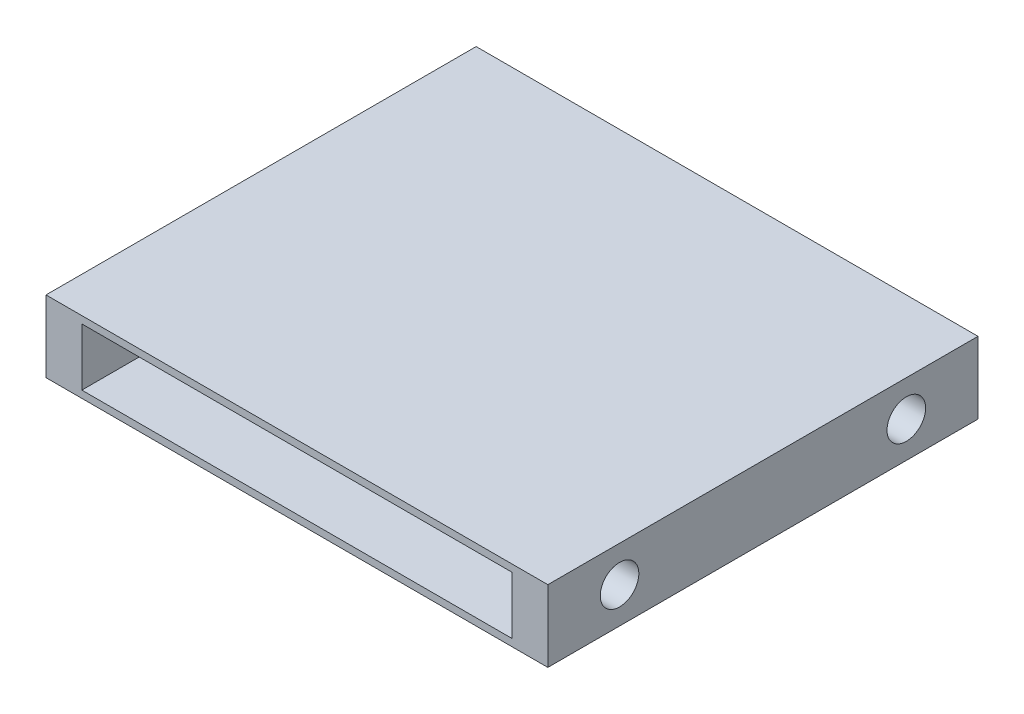
ISO-10303-21;
HEADER;
FILE_DESCRIPTION(('STEP AP214'),'2;1');
FILE_NAME('part.step','',(''),(''),'','','');
FILE_SCHEMA(('AUTOMOTIVE_DESIGN { 1 0 10303 214 1 1 1 1 }'));
ENDSEC;
DATA;
#1=APPLICATION_CONTEXT('core data for automotive mechanical design processes');
#2=APPLICATION_PROTOCOL_DEFINITION('international standard','automotive_design',2000,#1);
#3=PRODUCT_CONTEXT('',#1,'mechanical');
#4=PRODUCT('Part','Part','',(#3));
#5=PRODUCT_RELATED_PRODUCT_CATEGORY('part','',(#4));
#6=PRODUCT_DEFINITION_FORMATION('','',#4);
#7=PRODUCT_DEFINITION_CONTEXT('part definition',#1,'design');
#8=PRODUCT_DEFINITION('design','',#6,#7);
#9=PRODUCT_DEFINITION_SHAPE('','',#8);
#10=(LENGTH_UNIT() NAMED_UNIT(*) SI_UNIT(.MILLI.,.METRE.));
#11=(NAMED_UNIT(*) PLANE_ANGLE_UNIT() SI_UNIT($,.RADIAN.));
#12=(NAMED_UNIT(*) SI_UNIT($,.STERADIAN.) SOLID_ANGLE_UNIT());
#13=UNCERTAINTY_MEASURE_WITH_UNIT(LENGTH_MEASURE(1.E-05),#10,'distance_accuracy_value','');
#14=(GEOMETRIC_REPRESENTATION_CONTEXT(3) GLOBAL_UNCERTAINTY_ASSIGNED_CONTEXT((#13)) GLOBAL_UNIT_ASSIGNED_CONTEXT((#10,
#11,#12)) REPRESENTATION_CONTEXT('',''));
#15=CARTESIAN_POINT('',(0.,0.,0.));
#16=DIRECTION('',(0.,0.,1.));
#17=DIRECTION('',(1.,0.,0.));
#18=AXIS2_PLACEMENT_3D('',#15,#16,#17);
#19=CARTESIAN_POINT('',(0.,10.,0.));
#20=DIRECTION('',(1.,0.,0.));
#21=DIRECTION('',(0.,0.,-1.));
#22=AXIS2_PLACEMENT_3D('',#19,#20,#21);
#23=PLANE('',#22);
#24=CARTESIAN_POINT('',(0.,5.,50.));
#25=DIRECTION('',(1.,0.,0.));
#26=DIRECTION('',(0.,0.,-1.));
#27=AXIS2_PLACEMENT_3D('',#24,#25,#26);
#28=CIRCLE('',#27,2.68983581979043);
#29=CARTESIAN_POINT('',(0.,5.,47.3101641802095));
#30=VERTEX_POINT('',#29);
#31=EDGE_CURVE('E200',#30,#30,#28,.T.);
#32=ORIENTED_EDGE('',*,*,#31,.T.);
#33=EDGE_LOOP('',(#32));
#34=FACE_BOUND('',#33,.T.);
#35=CARTESIAN_POINT('',(0.,5.,10.));
#36=DIRECTION('',(1.,0.,0.));
#37=DIRECTION('',(0.,0.,-1.));
#38=AXIS2_PLACEMENT_3D('',#35,#36,#37);
#39=CIRCLE('',#38,2.68983581979043);
#40=CARTESIAN_POINT('',(0.,5.,7.31016418020958));
#41=VERTEX_POINT('',#40);
#42=EDGE_CURVE('E203',#41,#41,#39,.F.);
#43=ORIENTED_EDGE('',*,*,#42,.F.);
#44=EDGE_LOOP('',(#43));
#45=FACE_BOUND('',#44,.T.);
#46=DIRECTION('',(0.,0.,1.));
#47=VECTOR('',#46,1.);
#48=CARTESIAN_POINT('',(0.,0.,0.));
#49=LINE('',#48,#47);
#50=CARTESIAN_POINT('',(0.,0.,0.));
#51=VERTEX_POINT('',#50);
#52=CARTESIAN_POINT('',(0.,0.,60.));
#53=VERTEX_POINT('',#52);
#54=EDGE_CURVE('E146',#51,#53,#49,.T.);
#55=ORIENTED_EDGE('',*,*,#54,.T.);
#56=DIRECTION('',(0.,-1.,0.));
#57=VECTOR('',#56,1.);
#58=CARTESIAN_POINT('',(0.,10.,60.));
#59=LINE('',#58,#57);
#60=CARTESIAN_POINT('',(0.,10.,60.));
#61=VERTEX_POINT('',#60);
#62=EDGE_CURVE('E11',#61,#53,#59,.T.);
#63=ORIENTED_EDGE('',*,*,#62,.F.);
#64=DIRECTION('',(0.,0.,1.));
#65=VECTOR('',#64,1.);
#66=CARTESIAN_POINT('',(0.,10.,0.));
#67=LINE('',#66,#65);
#68=CARTESIAN_POINT('',(0.,10.,0.));
#69=VERTEX_POINT('',#68);
#70=EDGE_CURVE('E150',#69,#61,#67,.T.);
#71=ORIENTED_EDGE('',*,*,#70,.F.);
#72=DIRECTION('',(0.,-1.,0.));
#73=VECTOR('',#72,1.);
#74=CARTESIAN_POINT('',(0.,10.,0.));
#75=LINE('',#74,#73);
#76=EDGE_CURVE('E156',#69,#51,#75,.T.);
#77=ORIENTED_EDGE('',*,*,#76,.T.);
#78=EDGE_LOOP('',(#55,#63,#71,#77));
#79=FACE_BOUND('',#78,.T.);
#80=ADVANCED_FACE('F35',(#34,#45,#79),#23,.F.);
#81=CARTESIAN_POINT('',(0.,10.,60.));
#82=DIRECTION('',(0.,0.,-1.));
#83=DIRECTION('',(-1.,0.,0.));
#84=AXIS2_PLACEMENT_3D('',#81,#82,#83);
#85=PLANE('',#84);
#86=DIRECTION('',(1.,0.,0.));
#87=VECTOR('',#86,1.);
#88=CARTESIAN_POINT('',(5.00000000000002,0.999999999999999,60.));
#89=LINE('',#88,#87);
#90=CARTESIAN_POINT('',(5.00000000000002,0.999999999999999,60.));
#91=VERTEX_POINT('',#90);
#92=CARTESIAN_POINT('',(65.,0.999999999999999,60.));
#93=VERTEX_POINT('',#92);
#94=EDGE_CURVE('E140',#91,#93,#89,.T.);
#95=ORIENTED_EDGE('',*,*,#94,.F.);
#96=DIRECTION('',(0.,-1.,0.));
#97=VECTOR('',#96,1.);
#98=CARTESIAN_POINT('',(5.00000000000001,9.,60.));
#99=LINE('',#98,#97);
#100=CARTESIAN_POINT('',(5.00000000000001,9.,60.));
#101=VERTEX_POINT('',#100);
#102=EDGE_CURVE('E49',#101,#91,#99,.T.);
#103=ORIENTED_EDGE('',*,*,#102,.F.);
#104=DIRECTION('',(-1.,0.,0.));
#105=VECTOR('',#104,1.);
#106=CARTESIAN_POINT('',(5.00000000000001,9.,60.));
#107=LINE('',#106,#105);
#108=CARTESIAN_POINT('',(65.,9.,60.));
#109=VERTEX_POINT('',#108);
#110=EDGE_CURVE('E128',#109,#101,#107,.T.);
#111=ORIENTED_EDGE('',*,*,#110,.F.);
#112=DIRECTION('',(0.,1.,0.));
#113=VECTOR('',#112,1.);
#114=CARTESIAN_POINT('',(65.,9.,60.));
#115=LINE('',#114,#113);
#116=EDGE_CURVE('E131',#93,#109,#115,.T.);
#117=ORIENTED_EDGE('',*,*,#116,.F.);
#118=EDGE_LOOP('',(#95,#103,#111,#117));
#119=FACE_BOUND('',#118,.T.);
#120=DIRECTION('',(1.,0.,0.));
#121=VECTOR('',#120,1.);
#122=CARTESIAN_POINT('',(0.,0.,60.));
#123=LINE('',#122,#121);
#124=CARTESIAN_POINT('',(70.,0.,60.));
#125=VERTEX_POINT('',#124);
#126=EDGE_CURVE('E159',#53,#125,#123,.T.);
#127=ORIENTED_EDGE('',*,*,#126,.T.);
#128=DIRECTION('',(0.,-1.,0.));
#129=VECTOR('',#128,1.);
#130=CARTESIAN_POINT('',(70.,10.,60.));
#131=LINE('',#130,#129);
#132=CARTESIAN_POINT('',(70.,10.,60.));
#133=VERTEX_POINT('',#132);
#134=EDGE_CURVE('E42',#133,#125,#131,.T.);
#135=ORIENTED_EDGE('',*,*,#134,.F.);
#136=DIRECTION('',(1.,0.,0.));
#137=VECTOR('',#136,1.);
#138=CARTESIAN_POINT('',(0.,10.,60.));
#139=LINE('',#138,#137);
#140=EDGE_CURVE('E86',#61,#133,#139,.T.);
#141=ORIENTED_EDGE('',*,*,#140,.F.);
#142=ORIENTED_EDGE('',*,*,#62,.T.);
#143=EDGE_LOOP('',(#127,#135,#141,#142));
#144=FACE_BOUND('',#143,.T.);
#145=ADVANCED_FACE('F187',(#119,#144),#85,.F.);
#146=CARTESIAN_POINT('',(70.,10.,0.));
#147=DIRECTION('',(-1.,0.,0.));
#148=DIRECTION('',(0.,0.,1.));
#149=AXIS2_PLACEMENT_3D('',#146,#147,#148);
#150=PLANE('',#149);
#151=CARTESIAN_POINT('',(70.,5.,50.));
#152=DIRECTION('',(-1.,0.,0.));
#153=DIRECTION('',(0.,0.,1.));
#154=AXIS2_PLACEMENT_3D('',#151,#152,#153);
#155=CIRCLE('',#154,2.68983581979043);
#156=CARTESIAN_POINT('',(70.,5.,52.6898358197904));
#157=VERTEX_POINT('',#156);
#158=EDGE_CURVE('E216',#157,#157,#155,.F.);
#159=ORIENTED_EDGE('',*,*,#158,.F.);
#160=EDGE_LOOP('',(#159));
#161=FACE_BOUND('',#160,.T.);
#162=CARTESIAN_POINT('',(70.,5.,10.));
#163=DIRECTION('',(-1.,0.,0.));
#164=DIRECTION('',(0.,0.,1.));
#165=AXIS2_PLACEMENT_3D('',#162,#163,#164);
#166=CIRCLE('',#165,2.68983581979043);
#167=CARTESIAN_POINT('',(70.,5.,12.6898358197904));
#168=VERTEX_POINT('',#167);
#169=EDGE_CURVE('E134',#168,#168,#166,.T.);
#170=ORIENTED_EDGE('',*,*,#169,.T.);
#171=EDGE_LOOP('',(#170));
#172=FACE_BOUND('',#171,.T.);
#173=DIRECTION('',(0.,0.,-1.));
#174=VECTOR('',#173,1.);
#175=CARTESIAN_POINT('',(70.,0.,0.));
#176=LINE('',#175,#174);
#177=CARTESIAN_POINT('',(70.,0.,0.));
#178=VERTEX_POINT('',#177);
#179=EDGE_CURVE('E161',#125,#178,#176,.T.);
#180=ORIENTED_EDGE('',*,*,#179,.T.);
#181=DIRECTION('',(0.,-1.,0.));
#182=VECTOR('',#181,1.);
#183=CARTESIAN_POINT('',(70.,10.,0.));
#184=LINE('',#183,#182);
#185=CARTESIAN_POINT('',(70.,10.,0.));
#186=VERTEX_POINT('',#185);
#187=EDGE_CURVE('E165',#186,#178,#184,.T.);
#188=ORIENTED_EDGE('',*,*,#187,.F.);
#189=DIRECTION('',(0.,0.,-1.));
#190=VECTOR('',#189,1.);
#191=CARTESIAN_POINT('',(70.,10.,0.));
#192=LINE('',#191,#190);
#193=EDGE_CURVE('E153',#133,#186,#192,.T.);
#194=ORIENTED_EDGE('',*,*,#193,.F.);
#195=ORIENTED_EDGE('',*,*,#134,.T.);
#196=EDGE_LOOP('',(#180,#188,#194,#195));
#197=FACE_BOUND('',#196,.T.);
#198=ADVANCED_FACE('F170',(#161,#172,#197),#150,.F.);
#199=CARTESIAN_POINT('',(0.,10.,0.));
#200=DIRECTION('',(0.,0.,1.));
#201=DIRECTION('',(1.,0.,0.));
#202=AXIS2_PLACEMENT_3D('',#199,#200,#201);
#203=PLANE('',#202);
#204=DIRECTION('',(-1.,0.,0.));
#205=VECTOR('',#204,1.);
#206=CARTESIAN_POINT('',(0.,0.,0.));
#207=LINE('',#206,#205);
#208=EDGE_CURVE('E79',#178,#51,#207,.T.);
#209=ORIENTED_EDGE('',*,*,#208,.T.);
#210=ORIENTED_EDGE('',*,*,#76,.F.);
#211=DIRECTION('',(-1.,0.,0.));
#212=VECTOR('',#211,1.);
#213=CARTESIAN_POINT('',(0.,10.,0.));
#214=LINE('',#213,#212);
#215=EDGE_CURVE('E58',#186,#69,#214,.T.);
#216=ORIENTED_EDGE('',*,*,#215,.F.);
#217=ORIENTED_EDGE('',*,*,#187,.T.);
#218=EDGE_LOOP('',(#209,#210,#216,#217));
#219=FACE_BOUND('',#218,.T.);
#220=ADVANCED_FACE('F178',(#219),#203,.F.);
#221=CARTESIAN_POINT('',(0.,10.,0.));
#222=DIRECTION('',(0.,1.,0.));
#223=DIRECTION('',(0.,0.,1.));
#224=AXIS2_PLACEMENT_3D('',#221,#222,#223);
#225=PLANE('',#224);
#226=ORIENTED_EDGE('',*,*,#70,.T.);
#227=ORIENTED_EDGE('',*,*,#140,.T.);
#228=ORIENTED_EDGE('',*,*,#193,.T.);
#229=ORIENTED_EDGE('',*,*,#215,.T.);
#230=EDGE_LOOP('',(#226,#227,#228,#229));
#231=FACE_BOUND('',#230,.T.);
#232=ADVANCED_FACE('F180',(#231),#225,.T.);
#233=CARTESIAN_POINT('',(0.,0.,0.));
#234=DIRECTION('',(0.,1.,0.));
#235=DIRECTION('',(0.,0.,1.));
#236=AXIS2_PLACEMENT_3D('',#233,#234,#235);
#237=PLANE('',#236);
#238=ORIENTED_EDGE('',*,*,#54,.F.);
#239=ORIENTED_EDGE('',*,*,#208,.F.);
#240=ORIENTED_EDGE('',*,*,#179,.F.);
#241=ORIENTED_EDGE('',*,*,#126,.F.);
#242=EDGE_LOOP('',(#238,#239,#240,#241));
#243=FACE_BOUND('',#242,.T.);
#244=ADVANCED_FACE('F174',(#243),#237,.F.);
#245=CARTESIAN_POINT('',(5.00000000000001,9.,5.));
#246=DIRECTION('',(-1.,0.,0.));
#247=DIRECTION('',(0.,-1.,0.));
#248=AXIS2_PLACEMENT_3D('',#245,#246,#247);
#249=PLANE('',#248);
#250=CARTESIAN_POINT('',(4.99999999999999,5.,50.));
#251=DIRECTION('',(1.,0.,0.));
#252=DIRECTION('',(0.,0.,-1.));
#253=AXIS2_PLACEMENT_3D('',#250,#251,#252);
#254=CIRCLE('',#253,2.68983581979043);
#255=CARTESIAN_POINT('',(4.99999999999999,5.,47.3101641802095));
#256=VERTEX_POINT('',#255);
#257=EDGE_CURVE('E213',#256,#256,#254,.T.);
#258=ORIENTED_EDGE('',*,*,#257,.F.);
#259=EDGE_LOOP('',(#258));
#260=FACE_BOUND('',#259,.T.);
#261=CARTESIAN_POINT('',(4.99999999999999,5.,10.));
#262=DIRECTION('',(-1.,0.,0.));
#263=DIRECTION('',(0.,0.,1.));
#264=AXIS2_PLACEMENT_3D('',#261,#262,#263);
#265=CIRCLE('',#264,2.68983581979043);
#266=CARTESIAN_POINT('',(4.99999999999999,5.,12.6898358197904));
#267=VERTEX_POINT('',#266);
#268=EDGE_CURVE('E206',#267,#267,#265,.T.);
#269=ORIENTED_EDGE('',*,*,#268,.T.);
#270=EDGE_LOOP('',(#269));
#271=FACE_BOUND('',#270,.T.);
#272=ORIENTED_EDGE('',*,*,#102,.T.);
#273=DIRECTION('',(0.,0.,1.));
#274=VECTOR('',#273,1.);
#275=CARTESIAN_POINT('',(5.00000000000002,0.999999999999999,5.));
#276=LINE('',#275,#274);
#277=CARTESIAN_POINT('',(5.00000000000002,0.999999999999999,5.));
#278=VERTEX_POINT('',#277);
#279=EDGE_CURVE('E106',#278,#91,#276,.T.);
#280=ORIENTED_EDGE('',*,*,#279,.F.);
#281=DIRECTION('',(0.,-1.,0.));
#282=VECTOR('',#281,1.);
#283=CARTESIAN_POINT('',(5.00000000000001,9.,5.));
#284=LINE('',#283,#282);
#285=CARTESIAN_POINT('',(5.00000000000001,9.,5.));
#286=VERTEX_POINT('',#285);
#287=EDGE_CURVE('E110',#286,#278,#284,.T.);
#288=ORIENTED_EDGE('',*,*,#287,.F.);
#289=DIRECTION('',(0.,0.,1.));
#290=VECTOR('',#289,1.);
#291=CARTESIAN_POINT('',(5.00000000000001,9.,5.));
#292=LINE('',#291,#290);
#293=EDGE_CURVE('E144',#286,#101,#292,.T.);
#294=ORIENTED_EDGE('',*,*,#293,.T.);
#295=EDGE_LOOP('',(#272,#280,#288,#294));
#296=FACE_BOUND('',#295,.T.);
#297=ADVANCED_FACE('F108',(#260,#271,#296),#249,.F.);
#298=CARTESIAN_POINT('',(5.00000000000001,9.,5.));
#299=DIRECTION('',(0.,1.,0.));
#300=DIRECTION('',(0.,0.,1.));
#301=AXIS2_PLACEMENT_3D('',#298,#299,#300);
#302=PLANE('',#301);
#303=ORIENTED_EDGE('',*,*,#110,.T.);
#304=ORIENTED_EDGE('',*,*,#293,.F.);
#305=DIRECTION('',(-1.,0.,0.));
#306=VECTOR('',#305,1.);
#307=CARTESIAN_POINT('',(5.00000000000001,9.,5.));
#308=LINE('',#307,#306);
#309=CARTESIAN_POINT('',(65.,9.,5.));
#310=VERTEX_POINT('',#309);
#311=EDGE_CURVE('E116',#310,#286,#308,.T.);
#312=ORIENTED_EDGE('',*,*,#311,.F.);
#313=DIRECTION('',(0.,0.,1.));
#314=VECTOR('',#313,1.);
#315=CARTESIAN_POINT('',(65.,9.,5.));
#316=LINE('',#315,#314);
#317=EDGE_CURVE('E147',#310,#109,#316,.T.);
#318=ORIENTED_EDGE('',*,*,#317,.T.);
#319=EDGE_LOOP('',(#303,#304,#312,#318));
#320=FACE_BOUND('',#319,.T.);
#321=ADVANCED_FACE('F250',(#320),#302,.F.);
#322=CARTESIAN_POINT('',(65.,9.,5.));
#323=DIRECTION('',(1.,0.,0.));
#324=DIRECTION('',(0.,0.,-1.));
#325=AXIS2_PLACEMENT_3D('',#322,#323,#324);
#326=PLANE('',#325);
#327=CARTESIAN_POINT('',(65.,5.,50.));
#328=DIRECTION('',(1.,0.,0.));
#329=DIRECTION('',(0.,0.,-1.));
#330=AXIS2_PLACEMENT_3D('',#327,#328,#329);
#331=CIRCLE('',#330,2.68983581979043);
#332=CARTESIAN_POINT('',(65.,5.,47.3101641802096));
#333=VERTEX_POINT('',#332);
#334=EDGE_CURVE('E219',#333,#333,#331,.T.);
#335=ORIENTED_EDGE('',*,*,#334,.T.);
#336=EDGE_LOOP('',(#335));
#337=FACE_BOUND('',#336,.T.);
#338=CARTESIAN_POINT('',(65.,5.,10.));
#339=DIRECTION('',(-1.,0.,0.));
#340=DIRECTION('',(0.,0.,1.));
#341=AXIS2_PLACEMENT_3D('',#338,#339,#340);
#342=CIRCLE('',#341,2.68983581979043);
#343=CARTESIAN_POINT('',(65.,5.,12.6898358197904));
#344=VERTEX_POINT('',#343);
#345=EDGE_CURVE('E205',#344,#344,#342,.T.);
#346=ORIENTED_EDGE('',*,*,#345,.F.);
#347=EDGE_LOOP('',(#346));
#348=FACE_BOUND('',#347,.T.);
#349=ORIENTED_EDGE('',*,*,#116,.T.);
#350=ORIENTED_EDGE('',*,*,#317,.F.);
#351=DIRECTION('',(0.,1.,0.));
#352=VECTOR('',#351,1.);
#353=CARTESIAN_POINT('',(65.,9.,5.));
#354=LINE('',#353,#352);
#355=CARTESIAN_POINT('',(65.,0.999999999999999,5.));
#356=VERTEX_POINT('',#355);
#357=EDGE_CURVE('E124',#356,#310,#354,.T.);
#358=ORIENTED_EDGE('',*,*,#357,.F.);
#359=DIRECTION('',(0.,0.,1.));
#360=VECTOR('',#359,1.);
#361=CARTESIAN_POINT('',(65.,0.999999999999999,5.));
#362=LINE('',#361,#360);
#363=EDGE_CURVE('E115',#356,#93,#362,.T.);
#364=ORIENTED_EDGE('',*,*,#363,.T.);
#365=EDGE_LOOP('',(#349,#350,#358,#364));
#366=FACE_BOUND('',#365,.T.);
#367=ADVANCED_FACE('F223',(#337,#348,#366),#326,.F.);
#368=CARTESIAN_POINT('',(5.00000000000002,0.999999999999999,5.));
#369=DIRECTION('',(0.,-1.,0.));
#370=DIRECTION('',(0.,0.,-1.));
#371=AXIS2_PLACEMENT_3D('',#368,#369,#370);
#372=PLANE('',#371);
#373=ORIENTED_EDGE('',*,*,#94,.T.);
#374=ORIENTED_EDGE('',*,*,#363,.F.);
#375=DIRECTION('',(1.,0.,0.));
#376=VECTOR('',#375,1.);
#377=CARTESIAN_POINT('',(5.00000000000002,0.999999999999999,5.));
#378=LINE('',#377,#376);
#379=EDGE_CURVE('E119',#278,#356,#378,.T.);
#380=ORIENTED_EDGE('',*,*,#379,.F.);
#381=ORIENTED_EDGE('',*,*,#279,.T.);
#382=EDGE_LOOP('',(#373,#374,#380,#381));
#383=FACE_BOUND('',#382,.T.);
#384=ADVANCED_FACE('F120',(#383),#372,.F.);
#385=CARTESIAN_POINT('',(0.,0.,5.));
#386=DIRECTION('',(0.,0.,1.));
#387=DIRECTION('',(1.,0.,0.));
#388=AXIS2_PLACEMENT_3D('',#385,#386,#387);
#389=PLANE('',#388);
#390=ORIENTED_EDGE('',*,*,#287,.T.);
#391=ORIENTED_EDGE('',*,*,#379,.T.);
#392=ORIENTED_EDGE('',*,*,#357,.T.);
#393=ORIENTED_EDGE('',*,*,#311,.T.);
#394=EDGE_LOOP('',(#390,#391,#392,#393));
#395=FACE_BOUND('',#394,.T.);
#396=ADVANCED_FACE('F126',(#395),#389,.T.);
#397=CARTESIAN_POINT('',(120.,5.,10.));
#398=DIRECTION('',(-1.,0.,0.));
#399=DIRECTION('',(0.,0.,1.));
#400=AXIS2_PLACEMENT_3D('',#397,#398,#399);
#401=CYLINDRICAL_SURFACE('',#400,2.68983581979043);
#402=ORIENTED_EDGE('',*,*,#345,.T.);
#403=EDGE_LOOP('',(#402));
#404=FACE_BOUND('',#403,.T.);
#405=ORIENTED_EDGE('',*,*,#169,.F.);
#406=EDGE_LOOP('',(#405));
#407=FACE_BOUND('',#406,.T.);
#408=ADVANCED_FACE('F236',(#404,#407),#401,.F.);
#409=CARTESIAN_POINT('',(-50.,5.,10.));
#410=DIRECTION('',(1.,0.,0.));
#411=DIRECTION('',(0.,0.,-1.));
#412=AXIS2_PLACEMENT_3D('',#409,#410,#411);
#413=CYLINDRICAL_SURFACE('',#412,2.68983581979043);
#414=ORIENTED_EDGE('',*,*,#268,.F.);
#415=EDGE_LOOP('',(#414));
#416=FACE_BOUND('',#415,.T.);
#417=ORIENTED_EDGE('',*,*,#42,.T.);
#418=EDGE_LOOP('',(#417));
#419=FACE_BOUND('',#418,.T.);
#420=ADVANCED_FACE('F238',(#416,#419),#413,.F.);
#421=CARTESIAN_POINT('',(-50.,5.,50.));
#422=DIRECTION('',(1.,0.,0.));
#423=DIRECTION('',(0.,0.,-1.));
#424=AXIS2_PLACEMENT_3D('',#421,#422,#423);
#425=CYLINDRICAL_SURFACE('',#424,2.68983581979043);
#426=ORIENTED_EDGE('',*,*,#257,.T.);
#427=EDGE_LOOP('',(#426));
#428=FACE_BOUND('',#427,.T.);
#429=ORIENTED_EDGE('',*,*,#31,.F.);
#430=EDGE_LOOP('',(#429));
#431=FACE_BOUND('',#430,.T.);
#432=ADVANCED_FACE('F229',(#428,#431),#425,.F.);
#433=CARTESIAN_POINT('',(120.,5.,50.));
#434=DIRECTION('',(-1.,0.,0.));
#435=DIRECTION('',(0.,0.,1.));
#436=AXIS2_PLACEMENT_3D('',#433,#434,#435);
#437=CYLINDRICAL_SURFACE('',#436,2.68983581979043);
#438=ORIENTED_EDGE('',*,*,#334,.F.);
#439=EDGE_LOOP('',(#438));
#440=FACE_BOUND('',#439,.T.);
#441=ORIENTED_EDGE('',*,*,#158,.T.);
#442=EDGE_LOOP('',(#441));
#443=FACE_BOUND('',#442,.T.);
#444=ADVANCED_FACE('F226',(#440,#443),#437,.F.);
#445=CLOSED_SHELL('',(#80,#145,#198,#220,#232,#244,#297,#321,#367,#384,#396,#408,#420,#432,#444));
#446=MANIFOLD_SOLID_BREP('B2',#445);
#447=ADVANCED_BREP_SHAPE_REPRESENTATION('',(#18,#446),#14);
#448=SHAPE_DEFINITION_REPRESENTATION(#9,#447);
ENDSEC;
END-ISO-10303-21;
